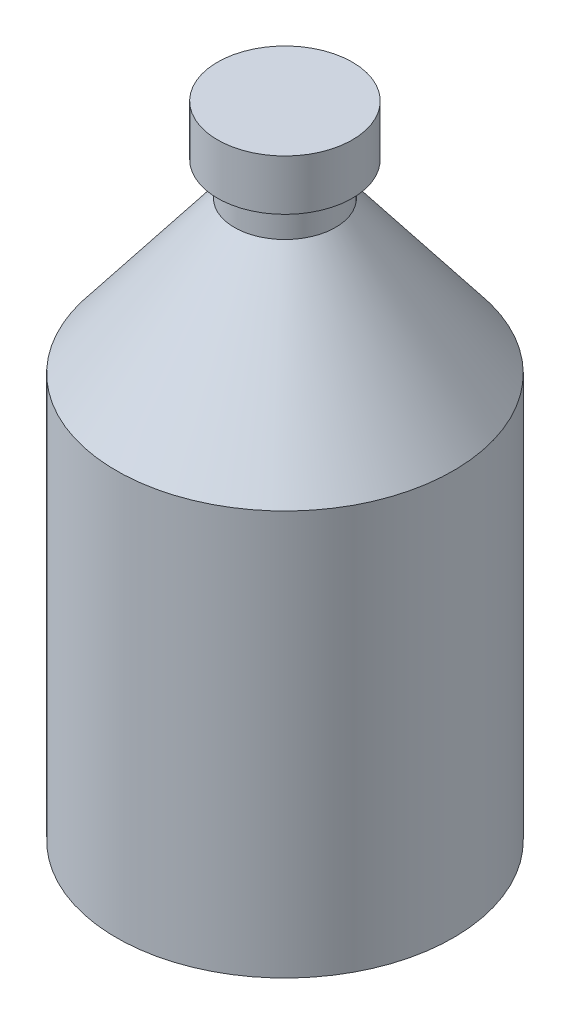
ISO-10303-21;
HEADER;
FILE_DESCRIPTION(('STEP AP214'),'2;1');
FILE_NAME('part.step','',(''),(''),'','','');
FILE_SCHEMA(('AUTOMOTIVE_DESIGN { 1 0 10303 214 1 1 1 1 }'));
ENDSEC;
DATA;
#1=APPLICATION_CONTEXT('core data for automotive mechanical design processes');
#2=APPLICATION_PROTOCOL_DEFINITION('international standard','automotive_design',2000,#1);
#3=PRODUCT_CONTEXT('',#1,'mechanical');
#4=PRODUCT('Part','Part','',(#3));
#5=PRODUCT_RELATED_PRODUCT_CATEGORY('part','',(#4));
#6=PRODUCT_DEFINITION_FORMATION('','',#4);
#7=PRODUCT_DEFINITION_CONTEXT('part definition',#1,'design');
#8=PRODUCT_DEFINITION('design','',#6,#7);
#9=PRODUCT_DEFINITION_SHAPE('','',#8);
#10=(LENGTH_UNIT() NAMED_UNIT(*) SI_UNIT(.MILLI.,.METRE.));
#11=(NAMED_UNIT(*) PLANE_ANGLE_UNIT() SI_UNIT($,.RADIAN.));
#12=(NAMED_UNIT(*) SI_UNIT($,.STERADIAN.) SOLID_ANGLE_UNIT());
#13=UNCERTAINTY_MEASURE_WITH_UNIT(LENGTH_MEASURE(1.E-05),#10,'distance_accuracy_value','');
#14=(GEOMETRIC_REPRESENTATION_CONTEXT(3) GLOBAL_UNCERTAINTY_ASSIGNED_CONTEXT((#13)) GLOBAL_UNIT_ASSIGNED_CONTEXT((#10,
#11,#12)) REPRESENTATION_CONTEXT('',''));
#15=CARTESIAN_POINT('',(0.,0.,0.));
#16=DIRECTION('',(0.,0.,1.));
#17=DIRECTION('',(1.,0.,0.));
#18=AXIS2_PLACEMENT_3D('',#15,#16,#17);
#19=CARTESIAN_POINT('',(0.,0.,0.));
#20=DIRECTION('',(0.,-1.,0.));
#21=DIRECTION('',(0.,0.,-1.));
#22=AXIS2_PLACEMENT_3D('',#19,#20,#21);
#23=PLANE('',#22);
#24=CARTESIAN_POINT('',(0.,0.,0.));
#25=DIRECTION('',(0.,-1.,0.));
#26=DIRECTION('',(0.,0.,-1.));
#27=AXIS2_PLACEMENT_3D('',#24,#25,#26);
#28=CIRCLE('',#27,31.75);
#29=CARTESIAN_POINT('',(0.,0.,-31.75));
#30=VERTEX_POINT('',#29);
#31=EDGE_CURVE('E10',#30,#30,#28,.T.);
#32=ORIENTED_EDGE('',*,*,#31,.T.);
#33=EDGE_LOOP('',(#32));
#34=FACE_BOUND('',#33,.T.);
#35=ADVANCED_FACE('F38',(#34),#23,.T.);
#36=CARTESIAN_POINT('',(0.,0.,0.));
#37=DIRECTION('',(0.,-1.,0.));
#38=DIRECTION('',(0.,0.,-1.));
#39=AXIS2_PLACEMENT_3D('',#36,#37,#38);
#40=CYLINDRICAL_SURFACE('',#39,31.75);
#41=CARTESIAN_POINT('',(0.,76.2,0.));
#42=DIRECTION('',(0.,-1.,0.));
#43=DIRECTION('',(0.,0.,-1.));
#44=AXIS2_PLACEMENT_3D('',#41,#42,#43);
#45=CIRCLE('',#44,31.75);
#46=CARTESIAN_POINT('',(0.,76.2,-31.75));
#47=VERTEX_POINT('',#46);
#48=EDGE_CURVE('E44',#47,#47,#45,.T.);
#49=ORIENTED_EDGE('',*,*,#48,.T.);
#50=EDGE_LOOP('',(#49));
#51=FACE_BOUND('',#50,.T.);
#52=ORIENTED_EDGE('',*,*,#31,.F.);
#53=EDGE_LOOP('',(#52));
#54=FACE_BOUND('',#53,.T.);
#55=ADVANCED_FACE('F76',(#51,#54),#40,.T.);
#56=CARTESIAN_POINT('',(0.,76.2,0.));
#57=DIRECTION('',(0.,-1.,0.));
#58=DIRECTION('',(0.,0.,-1.));
#59=AXIS2_PLACEMENT_3D('',#56,#57,#58);
#60=CONICAL_SURFACE('',#59,31.75,0.661043168850687);
#61=CARTESIAN_POINT('',(0.,104.775,0.));
#62=DIRECTION('',(0.,-1.,0.));
#63=DIRECTION('',(0.,0.,-1.));
#64=AXIS2_PLACEMENT_3D('',#61,#62,#63);
#65=CIRCLE('',#64,9.525);
#66=CARTESIAN_POINT('',(0.,104.775,-9.52499999999999));
#67=VERTEX_POINT('',#66);
#68=EDGE_CURVE('E48',#67,#67,#65,.T.);
#69=CARTESIAN_POINT('',(0.,104.775,-9.52499999999999));
#70=CARTESIAN_POINT('',(0.,104.47734375,-9.75651041666666));
#71=CARTESIAN_POINT('',(0.,104.1796875,-9.98802083333332));
#72=CARTESIAN_POINT('',(0.,103.584375,-10.4510416666667));
#73=CARTESIAN_POINT('',(0.,103.28671875,-10.6825520833333));
#74=CARTESIAN_POINT('',(0.,102.69140625,-11.1455729166667));
#75=CARTESIAN_POINT('',(0.,102.39375,-11.3770833333333));
#76=CARTESIAN_POINT('',(0.,101.7984375,-11.8401041666667));
#77=CARTESIAN_POINT('',(0.,101.50078125,-12.0716145833333));
#78=CARTESIAN_POINT('',(0.,100.90546875,-12.5346354166667));
#79=CARTESIAN_POINT('',(0.,100.6078125,-12.7661458333333));
#80=CARTESIAN_POINT('',(0.,100.0125,-13.2291666666667));
#81=CARTESIAN_POINT('',(0.,99.71484375,-13.4606770833333));
#82=CARTESIAN_POINT('',(0.,99.11953125,-13.9236979166667));
#83=CARTESIAN_POINT('',(0.,98.821875,-14.1552083333333));
#84=CARTESIAN_POINT('',(0.,98.2265625,-14.6182291666667));
#85=CARTESIAN_POINT('',(0.,97.92890625,-14.8497395833333));
#86=CARTESIAN_POINT('',(0.,97.33359375,-15.3127604166667));
#87=CARTESIAN_POINT('',(0.,97.0359375,-15.5442708333333));
#88=CARTESIAN_POINT('',(0.,96.440625,-16.0072916666667));
#89=CARTESIAN_POINT('',(0.,96.14296875,-16.2388020833333));
#90=CARTESIAN_POINT('',(0.,95.54765625,-16.7018229166667));
#91=CARTESIAN_POINT('',(0.,95.25,-16.9333333333333));
#92=CARTESIAN_POINT('',(0.,94.6546875,-17.3963541666667));
#93=CARTESIAN_POINT('',(0.,94.35703125,-17.6278645833333));
#94=CARTESIAN_POINT('',(0.,93.76171875,-18.0908854166667));
#95=CARTESIAN_POINT('',(0.,93.4640625,-18.3223958333333));
#96=CARTESIAN_POINT('',(0.,92.86875,-18.7854166666667));
#97=CARTESIAN_POINT('',(0.,92.57109375,-19.0169270833333));
#98=CARTESIAN_POINT('',(0.,91.97578125,-19.4799479166667));
#99=CARTESIAN_POINT('',(0.,91.678125,-19.7114583333333));
#100=CARTESIAN_POINT('',(0.,91.0828125,-20.1744791666667));
#101=CARTESIAN_POINT('',(0.,90.78515625,-20.4059895833333));
#102=CARTESIAN_POINT('',(0.,90.18984375,-20.8690104166667));
#103=CARTESIAN_POINT('',(0.,89.8921875,-21.1005208333333));
#104=CARTESIAN_POINT('',(0.,89.296875,-21.5635416666667));
#105=CARTESIAN_POINT('',(0.,88.99921875,-21.7950520833333));
#106=CARTESIAN_POINT('',(0.,88.40390625,-22.2580729166667));
#107=CARTESIAN_POINT('',(0.,88.10625,-22.4895833333333));
#108=CARTESIAN_POINT('',(0.,87.5109375,-22.9526041666667));
#109=CARTESIAN_POINT('',(0.,87.21328125,-23.1841145833333));
#110=CARTESIAN_POINT('',(0.,86.61796875,-23.6471354166667));
#111=CARTESIAN_POINT('',(0.,86.3203125,-23.8786458333333));
#112=CARTESIAN_POINT('',(0.,85.725,-24.3416666666667));
#113=CARTESIAN_POINT('',(0.,85.42734375,-24.5731770833333));
#114=CARTESIAN_POINT('',(0.,84.83203125,-25.0361979166667));
#115=CARTESIAN_POINT('',(0.,84.534375,-25.2677083333333));
#116=CARTESIAN_POINT('',(0.,83.9390625,-25.7307291666667));
#117=CARTESIAN_POINT('',(0.,83.64140625,-25.9622395833333));
#118=CARTESIAN_POINT('',(0.,83.04609375,-26.4252604166667));
#119=CARTESIAN_POINT('',(0.,82.7484375,-26.6567708333333));
#120=CARTESIAN_POINT('',(0.,82.153125,-27.1197916666667));
#121=CARTESIAN_POINT('',(0.,81.85546875,-27.3513020833333));
#122=CARTESIAN_POINT('',(0.,81.26015625,-27.8143229166667));
#123=CARTESIAN_POINT('',(0.,80.9625,-28.0458333333333));
#124=CARTESIAN_POINT('',(0.,80.3671875,-28.5088541666667));
#125=CARTESIAN_POINT('',(0.,80.06953125,-28.7403645833333));
#126=CARTESIAN_POINT('',(0.,79.47421875,-29.2033854166667));
#127=CARTESIAN_POINT('',(0.,79.1765625,-29.4348958333333));
#128=CARTESIAN_POINT('',(0.,78.58125,-29.8979166666667));
#129=CARTESIAN_POINT('',(0.,78.28359375,-30.1294270833333));
#130=CARTESIAN_POINT('',(0.,77.68828125,-30.5924479166667));
#131=CARTESIAN_POINT('',(0.,77.390625,-30.8239583333333));
#132=CARTESIAN_POINT('',(0.,76.7953125,-31.2869791666667));
#133=CARTESIAN_POINT('',(0.,76.49765625,-31.5184895833333));
#134=CARTESIAN_POINT('',(0.,76.2,-31.75));
#135=B_SPLINE_CURVE_WITH_KNOTS('',3,(#69,#70,#71,#72,#73,#74,#75,#76,#77,#78,#79,#80,#81,#82,
#83,#84,#85,#86,#87,#88,#89,#90,#91,#92,#93,#94,#95,#96,#97,#98,#99,#100,#101,#102,#103,#104,
#105,#106,#107,#108,#109,#110,#111,#112,#113,#114,#115,#116,#117,#118,#119,#120,#121,#122,#123,
#124,#125,#126,#127,#128,#129,#130,#131,#132,#133,#134),.UNSPECIFIED.,.F.,.F.,(4,2,2,2,2,2,2,2,
2,2,2,2,2,2,2,2,2,2,2,2,2,2,2,2,2,2,2,2,2,2,2,2,4),(0.,1.13126780459055,2.2625356091811,
3.39380341377165,4.52507121836221,5.65633902295276,6.78760682754331,7.91887463213386,
9.05014243672441,10.181410241315,11.3126780459055,12.4439458504961,13.5752136550866,
14.7064814596772,15.8377492642677,16.9690170688583,18.1002848734488,19.2315526780394,
20.3628204826299,21.4940882872205,22.625356091811,23.7566238964016,24.8878917009921,
26.0191595055827,27.1504273101732,28.2816951147638,29.4129629193543,30.5442307239449,
31.6754985285354,32.806766333126,33.9380341377165,35.0693019423071,36.2005697468976),.UNSPECIFIED.);
#136=EDGE_CURVE('BSEAM80',#67,#47,#135,.T.);
#137=ORIENTED_EDGE('',*,*,#68,.T.);
#138=ORIENTED_EDGE('',*,*,#48,.F.);
#139=ORIENTED_EDGE('',*,*,#136,.T.);
#140=ORIENTED_EDGE('',*,*,#136,.F.);
#141=EDGE_LOOP('',(#137,#139,#138,#140));
#142=FACE_BOUND('',#141,.T.);
#143=ADVANCED_FACE('F80',(#142),#60,.T.);
#144=CARTESIAN_POINT('',(0.,0.,0.));
#145=DIRECTION('',(0.,-1.,0.));
#146=DIRECTION('',(0.,0.,-1.));
#147=AXIS2_PLACEMENT_3D('',#144,#145,#146);
#148=CYLINDRICAL_SURFACE('',#147,9.525);
#149=CARTESIAN_POINT('',(0.,111.125,0.));
#150=DIRECTION('',(0.,-1.,0.));
#151=DIRECTION('',(0.,0.,-1.));
#152=AXIS2_PLACEMENT_3D('',#149,#150,#151);
#153=CIRCLE('',#152,9.525);
#154=CARTESIAN_POINT('',(0.,111.125,-9.525));
#155=VERTEX_POINT('',#154);
#156=EDGE_CURVE('E52',#155,#155,#153,.T.);
#157=ORIENTED_EDGE('',*,*,#156,.T.);
#158=EDGE_LOOP('',(#157));
#159=FACE_BOUND('',#158,.T.);
#160=ORIENTED_EDGE('',*,*,#68,.F.);
#161=EDGE_LOOP('',(#160));
#162=FACE_BOUND('',#161,.T.);
#163=ADVANCED_FACE('F84',(#159,#162),#148,.T.);
#164=CARTESIAN_POINT('',(0.,111.125,-12.7));
#165=DIRECTION('',(0.,-1.,0.));
#166=DIRECTION('',(0.,0.,-1.));
#167=AXIS2_PLACEMENT_3D('',#164,#165,#166);
#168=PLANE('',#167);
#169=CARTESIAN_POINT('',(0.,111.125,0.));
#170=DIRECTION('',(0.,-1.,0.));
#171=DIRECTION('',(0.,0.,-1.));
#172=AXIS2_PLACEMENT_3D('',#169,#170,#171);
#173=CIRCLE('',#172,12.7);
#174=CARTESIAN_POINT('',(0.,111.125,-12.7));
#175=VERTEX_POINT('',#174);
#176=EDGE_CURVE('E57',#175,#175,#173,.T.);
#177=ORIENTED_EDGE('',*,*,#176,.T.);
#178=EDGE_LOOP('',(#177));
#179=FACE_BOUND('',#178,.T.);
#180=ORIENTED_EDGE('',*,*,#156,.F.);
#181=EDGE_LOOP('',(#180));
#182=FACE_BOUND('',#181,.T.);
#183=ADVANCED_FACE('F73',(#179,#182),#168,.T.);
#184=CARTESIAN_POINT('',(0.,0.,0.));
#185=DIRECTION('',(0.,-1.,0.));
#186=DIRECTION('',(0.,0.,-1.));
#187=AXIS2_PLACEMENT_3D('',#184,#185,#186);
#188=CYLINDRICAL_SURFACE('',#187,12.7);
#189=CARTESIAN_POINT('',(0.,120.65,0.));
#190=DIRECTION('',(0.,-1.,0.));
#191=DIRECTION('',(0.,0.,-1.));
#192=AXIS2_PLACEMENT_3D('',#189,#190,#191);
#193=CIRCLE('',#192,12.7);
#194=CARTESIAN_POINT('',(0.,120.65,-12.7));
#195=VERTEX_POINT('',#194);
#196=EDGE_CURVE('E60',#195,#195,#193,.T.);
#197=ORIENTED_EDGE('',*,*,#196,.T.);
#198=EDGE_LOOP('',(#197));
#199=FACE_BOUND('',#198,.T.);
#200=ORIENTED_EDGE('',*,*,#176,.F.);
#201=EDGE_LOOP('',(#200));
#202=FACE_BOUND('',#201,.T.);
#203=ADVANCED_FACE('F64',(#199,#202),#188,.T.);
#204=CARTESIAN_POINT('',(0.,120.65,0.));
#205=DIRECTION('',(0.,1.,0.));
#206=DIRECTION('',(0.,0.,1.));
#207=AXIS2_PLACEMENT_3D('',#204,#205,#206);
#208=PLANE('',#207);
#209=ORIENTED_EDGE('',*,*,#196,.F.);
#210=EDGE_LOOP('',(#209));
#211=FACE_BOUND('',#210,.T.);
#212=ADVANCED_FACE('F67',(#211),#208,.T.);
#213=CLOSED_SHELL('',(#35,#55,#143,#163,#183,#203,#212));
#214=MANIFOLD_SOLID_BREP('B2',#213);
#215=ADVANCED_BREP_SHAPE_REPRESENTATION('',(#18,#214),#14);
#216=SHAPE_DEFINITION_REPRESENTATION(#9,#215);
ENDSEC;
END-ISO-10303-21;
